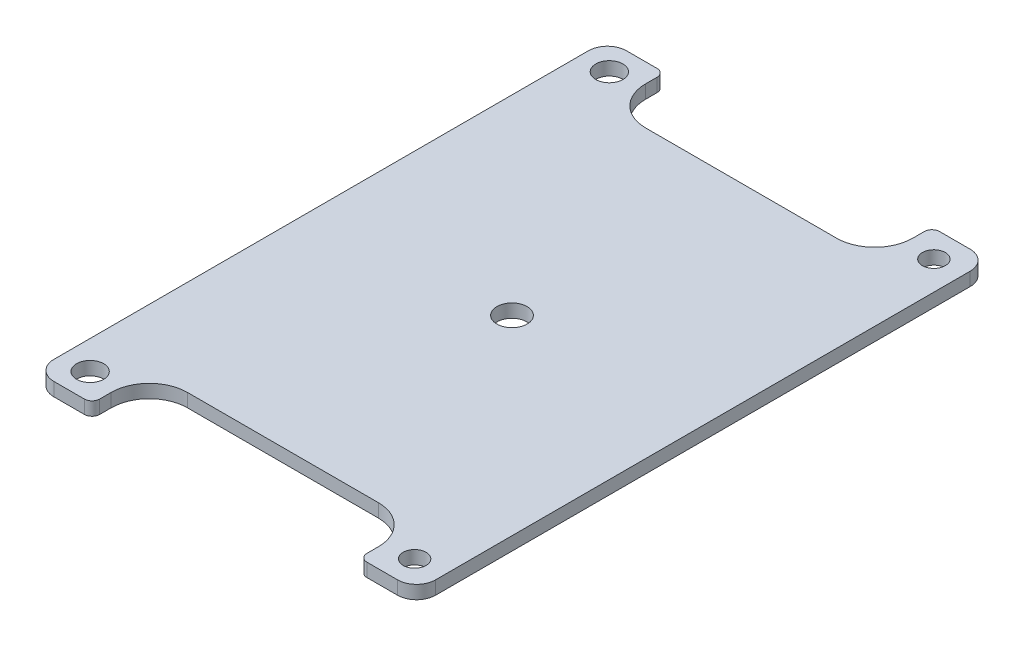
ISO-10303-21;
HEADER;
FILE_DESCRIPTION(('STEP AP214'),'2;1');
FILE_NAME('part.step','',(''),(''),'','','');
FILE_SCHEMA(('AUTOMOTIVE_DESIGN { 1 0 10303 214 1 1 1 1 }'));
ENDSEC;
DATA;
#1=APPLICATION_CONTEXT('core data for automotive mechanical design processes');
#2=APPLICATION_PROTOCOL_DEFINITION('international standard','automotive_design',2000,#1);
#3=PRODUCT_CONTEXT('',#1,'mechanical');
#4=PRODUCT('Part','Part','',(#3));
#5=PRODUCT_RELATED_PRODUCT_CATEGORY('part','',(#4));
#6=PRODUCT_DEFINITION_FORMATION('','',#4);
#7=PRODUCT_DEFINITION_CONTEXT('part definition',#1,'design');
#8=PRODUCT_DEFINITION('design','',#6,#7);
#9=PRODUCT_DEFINITION_SHAPE('','',#8);
#10=(LENGTH_UNIT() NAMED_UNIT(*) SI_UNIT(.MILLI.,.METRE.));
#11=(NAMED_UNIT(*) PLANE_ANGLE_UNIT() SI_UNIT($,.RADIAN.));
#12=(NAMED_UNIT(*) SI_UNIT($,.STERADIAN.) SOLID_ANGLE_UNIT());
#13=UNCERTAINTY_MEASURE_WITH_UNIT(LENGTH_MEASURE(1.E-05),#10,'distance_accuracy_value','');
#14=(GEOMETRIC_REPRESENTATION_CONTEXT(3) GLOBAL_UNCERTAINTY_ASSIGNED_CONTEXT((#13)) GLOBAL_UNIT_ASSIGNED_CONTEXT((#10,
#11,#12)) REPRESENTATION_CONTEXT('',''));
#15=CARTESIAN_POINT('',(0.,0.,0.));
#16=DIRECTION('',(0.,0.,1.));
#17=DIRECTION('',(1.,0.,0.));
#18=AXIS2_PLACEMENT_3D('',#15,#16,#17);
#19=CARTESIAN_POINT('',(-45.,3.5,-70.));
#20=DIRECTION('',(0.,-1.,0.));
#21=DIRECTION('',(0.,0.,-1.));
#22=AXIS2_PLACEMENT_3D('',#19,#20,#21);
#23=CYLINDRICAL_SURFACE('',#22,5.);
#24=CARTESIAN_POINT('',(-45.,0.,-70.));
#25=DIRECTION('',(0.,1.,0.));
#26=DIRECTION('',(0.,0.,1.));
#27=AXIS2_PLACEMENT_3D('',#24,#25,#26);
#28=CIRCLE('',#27,5.);
#29=CARTESIAN_POINT('',(-45.,0.,-75.));
#30=VERTEX_POINT('',#29);
#31=CARTESIAN_POINT('',(-50.,0.,-70.));
#32=VERTEX_POINT('',#31);
#33=EDGE_CURVE('E237',#30,#32,#28,.T.);
#34=ORIENTED_EDGE('',*,*,#33,.T.);
#35=DIRECTION('',(0.,-1.,0.));
#36=VECTOR('',#35,1.);
#37=CARTESIAN_POINT('',(-50.,3.5,-70.));
#38=LINE('',#37,#36);
#39=CARTESIAN_POINT('',(-50.,3.5,-70.));
#40=VERTEX_POINT('',#39);
#41=EDGE_CURVE('E11',#40,#32,#38,.T.);
#42=ORIENTED_EDGE('',*,*,#41,.F.);
#43=CARTESIAN_POINT('',(-45.,3.5,-70.));
#44=DIRECTION('',(0.,1.,0.));
#45=DIRECTION('',(0.,0.,1.));
#46=AXIS2_PLACEMENT_3D('',#43,#44,#45);
#47=CIRCLE('',#46,5.);
#48=CARTESIAN_POINT('',(-45.,3.5,-75.));
#49=VERTEX_POINT('',#48);
#50=EDGE_CURVE('E300',#49,#40,#47,.T.);
#51=ORIENTED_EDGE('',*,*,#50,.F.);
#52=DIRECTION('',(0.,-1.,0.));
#53=VECTOR('',#52,1.);
#54=CARTESIAN_POINT('',(-45.,3.5,-75.));
#55=LINE('',#54,#53);
#56=EDGE_CURVE('E59',#49,#30,#55,.T.);
#57=ORIENTED_EDGE('',*,*,#56,.T.);
#58=EDGE_LOOP('',(#34,#42,#51,#57));
#59=FACE_BOUND('',#58,.T.);
#60=ADVANCED_FACE('F43',(#59),#23,.T.);
#61=CARTESIAN_POINT('',(-50.,3.5,-70.));
#62=DIRECTION('',(1.,0.,0.));
#63=DIRECTION('',(0.,0.,-1.));
#64=AXIS2_PLACEMENT_3D('',#61,#62,#63);
#65=PLANE('',#64);
#66=DIRECTION('',(0.,0.,1.));
#67=VECTOR('',#66,1.);
#68=CARTESIAN_POINT('',(-50.,0.,-70.));
#69=LINE('',#68,#67);
#70=CARTESIAN_POINT('',(-50.,0.,70.));
#71=VERTEX_POINT('',#70);
#72=EDGE_CURVE('E239',#32,#71,#69,.T.);
#73=ORIENTED_EDGE('',*,*,#72,.T.);
#74=DIRECTION('',(0.,-1.,0.));
#75=VECTOR('',#74,1.);
#76=CARTESIAN_POINT('',(-50.,3.5,70.));
#77=LINE('',#76,#75);
#78=CARTESIAN_POINT('',(-50.,3.5,70.));
#79=VERTEX_POINT('',#78);
#80=EDGE_CURVE('E51',#79,#71,#77,.T.);
#81=ORIENTED_EDGE('',*,*,#80,.F.);
#82=DIRECTION('',(0.,0.,1.));
#83=VECTOR('',#82,1.);
#84=CARTESIAN_POINT('',(-50.,3.5,-70.));
#85=LINE('',#84,#83);
#86=EDGE_CURVE('E146',#40,#79,#85,.T.);
#87=ORIENTED_EDGE('',*,*,#86,.F.);
#88=ORIENTED_EDGE('',*,*,#41,.T.);
#89=EDGE_LOOP('',(#73,#81,#87,#88));
#90=FACE_BOUND('',#89,.T.);
#91=ADVANCED_FACE('F428',(#90),#65,.F.);
#92=CARTESIAN_POINT('',(-45.,3.5,70.));
#93=DIRECTION('',(0.,-1.,0.));
#94=DIRECTION('',(0.,0.,-1.));
#95=AXIS2_PLACEMENT_3D('',#92,#93,#94);
#96=CYLINDRICAL_SURFACE('',#95,5.);
#97=CARTESIAN_POINT('',(-45.,0.,70.));
#98=DIRECTION('',(0.,1.,0.));
#99=DIRECTION('',(0.,0.,1.));
#100=AXIS2_PLACEMENT_3D('',#97,#98,#99);
#101=CIRCLE('',#100,5.);
#102=CARTESIAN_POINT('',(-45.,0.,75.));
#103=VERTEX_POINT('',#102);
#104=EDGE_CURVE('E242',#71,#103,#101,.T.);
#105=ORIENTED_EDGE('',*,*,#104,.T.);
#106=DIRECTION('',(0.,-1.,0.));
#107=VECTOR('',#106,1.);
#108=CARTESIAN_POINT('',(-45.,3.5,75.));
#109=LINE('',#108,#107);
#110=CARTESIAN_POINT('',(-45.,3.5,75.));
#111=VERTEX_POINT('',#110);
#112=EDGE_CURVE('E341',#111,#103,#109,.T.);
#113=ORIENTED_EDGE('',*,*,#112,.F.);
#114=CARTESIAN_POINT('',(-45.,3.5,70.));
#115=DIRECTION('',(0.,1.,0.));
#116=DIRECTION('',(0.,0.,1.));
#117=AXIS2_PLACEMENT_3D('',#114,#115,#116);
#118=CIRCLE('',#117,5.);
#119=EDGE_CURVE('E349',#79,#111,#118,.T.);
#120=ORIENTED_EDGE('',*,*,#119,.F.);
#121=ORIENTED_EDGE('',*,*,#80,.T.);
#122=EDGE_LOOP('',(#105,#113,#120,#121));
#123=FACE_BOUND('',#122,.T.);
#124=ADVANCED_FACE('F347',(#123),#96,.T.);
#125=CARTESIAN_POINT('',(-45.,3.5,75.));
#126=DIRECTION('',(0.,0.,-1.));
#127=DIRECTION('',(-1.,0.,0.));
#128=AXIS2_PLACEMENT_3D('',#125,#126,#127);
#129=PLANE('',#128);
#130=DIRECTION('',(1.,0.,0.));
#131=VECTOR('',#130,1.);
#132=CARTESIAN_POINT('',(-45.,0.,75.));
#133=LINE('',#132,#131);
#134=CARTESIAN_POINT('',(-37.,0.,75.));
#135=VERTEX_POINT('',#134);
#136=EDGE_CURVE('E244',#103,#135,#133,.T.);
#137=ORIENTED_EDGE('',*,*,#136,.T.);
#138=DIRECTION('',(0.,-1.,0.));
#139=VECTOR('',#138,1.);
#140=CARTESIAN_POINT('',(-37.,3.5,75.));
#141=LINE('',#140,#139);
#142=CARTESIAN_POINT('',(-37.,3.5,75.));
#143=VERTEX_POINT('',#142);
#144=EDGE_CURVE('E339',#143,#135,#141,.T.);
#145=ORIENTED_EDGE('',*,*,#144,.F.);
#146=DIRECTION('',(1.,0.,0.));
#147=VECTOR('',#146,1.);
#148=CARTESIAN_POINT('',(-45.,3.5,75.));
#149=LINE('',#148,#147);
#150=EDGE_CURVE('E359',#111,#143,#149,.T.);
#151=ORIENTED_EDGE('',*,*,#150,.F.);
#152=ORIENTED_EDGE('',*,*,#112,.T.);
#153=EDGE_LOOP('',(#137,#145,#151,#152));
#154=FACE_BOUND('',#153,.T.);
#155=ADVANCED_FACE('F356',(#154),#129,.F.);
#156=CARTESIAN_POINT('',(-37.,3.5,73.));
#157=DIRECTION('',(0.,-1.,0.));
#158=DIRECTION('',(0.,0.,-1.));
#159=AXIS2_PLACEMENT_3D('',#156,#157,#158);
#160=CYLINDRICAL_SURFACE('',#159,2.);
#161=CARTESIAN_POINT('',(-37.,0.,73.));
#162=DIRECTION('',(0.,-1.,0.));
#163=DIRECTION('',(0.,0.,-1.));
#164=AXIS2_PLACEMENT_3D('',#161,#162,#163);
#165=CIRCLE('',#164,2.);
#166=CARTESIAN_POINT('',(-35.,0.,73.));
#167=VERTEX_POINT('',#166);
#168=EDGE_CURVE('E247',#167,#135,#165,.T.);
#169=ORIENTED_EDGE('',*,*,#168,.F.);
#170=DIRECTION('',(0.,-1.,0.));
#171=VECTOR('',#170,1.);
#172=CARTESIAN_POINT('',(-35.,3.5,73.));
#173=LINE('',#172,#171);
#174=CARTESIAN_POINT('',(-35.,3.5,73.));
#175=VERTEX_POINT('',#174);
#176=EDGE_CURVE('E337',#175,#167,#173,.T.);
#177=ORIENTED_EDGE('',*,*,#176,.F.);
#178=CARTESIAN_POINT('',(-37.,3.5,73.));
#179=DIRECTION('',(0.,-1.,0.));
#180=DIRECTION('',(0.,0.,-1.));
#181=AXIS2_PLACEMENT_3D('',#178,#179,#180);
#182=CIRCLE('',#181,2.);
#183=EDGE_CURVE('E361',#175,#143,#182,.T.);
#184=ORIENTED_EDGE('',*,*,#183,.T.);
#185=ORIENTED_EDGE('',*,*,#144,.T.);
#186=EDGE_LOOP('',(#169,#177,#184,#185));
#187=FACE_BOUND('',#186,.T.);
#188=ADVANCED_FACE('F755',(#187),#160,.T.);
#189=CARTESIAN_POINT('',(-35.,3.5,70.0000000000001));
#190=DIRECTION('',(1.,0.,0.));
#191=DIRECTION('',(0.,0.,-1.));
#192=AXIS2_PLACEMENT_3D('',#189,#190,#191);
#193=PLANE('',#192);
#194=DIRECTION('',(0.,0.,1.));
#195=VECTOR('',#194,1.);
#196=CARTESIAN_POINT('',(-35.,0.,70.0000000000001));
#197=LINE('',#196,#195);
#198=CARTESIAN_POINT('',(-35.,0.,70.0000000000001));
#199=VERTEX_POINT('',#198);
#200=EDGE_CURVE('E250',#199,#167,#197,.T.);
#201=ORIENTED_EDGE('',*,*,#200,.F.);
#202=DIRECTION('',(0.,-1.,0.));
#203=VECTOR('',#202,1.);
#204=CARTESIAN_POINT('',(-35.,3.5,70.0000000000001));
#205=LINE('',#204,#203);
#206=CARTESIAN_POINT('',(-35.,3.5,70.0000000000001));
#207=VERTEX_POINT('',#206);
#208=EDGE_CURVE('E335',#207,#199,#205,.T.);
#209=ORIENTED_EDGE('',*,*,#208,.F.);
#210=DIRECTION('',(0.,0.,1.));
#211=VECTOR('',#210,1.);
#212=CARTESIAN_POINT('',(-35.,3.5,70.0000000000001));
#213=LINE('',#212,#211);
#214=EDGE_CURVE('E363',#207,#175,#213,.T.);
#215=ORIENTED_EDGE('',*,*,#214,.T.);
#216=ORIENTED_EDGE('',*,*,#176,.T.);
#217=EDGE_LOOP('',(#201,#209,#215,#216));
#218=FACE_BOUND('',#217,.T.);
#219=ADVANCED_FACE('F744',(#218),#193,.T.);
#220=CARTESIAN_POINT('',(-25.,3.5,70.));
#221=DIRECTION('',(0.,-1.,0.));
#222=DIRECTION('',(0.,0.,-1.));
#223=AXIS2_PLACEMENT_3D('',#220,#221,#222);
#224=CYLINDRICAL_SURFACE('',#223,10.);
#225=CARTESIAN_POINT('',(-25.,0.,70.));
#226=DIRECTION('',(0.,1.,0.));
#227=DIRECTION('',(0.,0.,1.));
#228=AXIS2_PLACEMENT_3D('',#225,#226,#227);
#229=CIRCLE('',#228,10.);
#230=CARTESIAN_POINT('',(-24.9999999999999,0.,60.));
#231=VERTEX_POINT('',#230);
#232=EDGE_CURVE('E253',#231,#199,#229,.T.);
#233=ORIENTED_EDGE('',*,*,#232,.F.);
#234=DIRECTION('',(0.,-1.,0.));
#235=VECTOR('',#234,1.);
#236=CARTESIAN_POINT('',(-24.9999999999999,3.5,60.));
#237=LINE('',#236,#235);
#238=CARTESIAN_POINT('',(-24.9999999999999,3.5,60.));
#239=VERTEX_POINT('',#238);
#240=EDGE_CURVE('E333',#239,#231,#237,.T.);
#241=ORIENTED_EDGE('',*,*,#240,.F.);
#242=CARTESIAN_POINT('',(-25.,3.5,70.));
#243=DIRECTION('',(0.,1.,0.));
#244=DIRECTION('',(0.,0.,1.));
#245=AXIS2_PLACEMENT_3D('',#242,#243,#244);
#246=CIRCLE('',#245,10.);
#247=EDGE_CURVE('E370',#239,#207,#246,.T.);
#248=ORIENTED_EDGE('',*,*,#247,.T.);
#249=ORIENTED_EDGE('',*,*,#208,.T.);
#250=EDGE_LOOP('',(#233,#241,#248,#249));
#251=FACE_BOUND('',#250,.T.);
#252=ADVANCED_FACE('F733',(#251),#224,.F.);
#253=CARTESIAN_POINT('',(-24.9999999999999,3.5,60.));
#254=DIRECTION('',(0.,0.,-1.));
#255=DIRECTION('',(-1.,0.,0.));
#256=AXIS2_PLACEMENT_3D('',#253,#254,#255);
#257=PLANE('',#256);
#258=DIRECTION('',(1.,0.,0.));
#259=VECTOR('',#258,1.);
#260=CARTESIAN_POINT('',(-24.9999999999999,0.,60.));
#261=LINE('',#260,#259);
#262=CARTESIAN_POINT('',(24.9999999999999,0.,60.));
#263=VERTEX_POINT('',#262);
#264=EDGE_CURVE('E256',#231,#263,#261,.T.);
#265=ORIENTED_EDGE('',*,*,#264,.T.);
#266=DIRECTION('',(0.,-1.,0.));
#267=VECTOR('',#266,1.);
#268=CARTESIAN_POINT('',(24.9999999999999,3.5,60.));
#269=LINE('',#268,#267);
#270=CARTESIAN_POINT('',(24.9999999999999,3.5,60.));
#271=VERTEX_POINT('',#270);
#272=EDGE_CURVE('E331',#271,#263,#269,.T.);
#273=ORIENTED_EDGE('',*,*,#272,.F.);
#274=DIRECTION('',(1.,0.,0.));
#275=VECTOR('',#274,1.);
#276=CARTESIAN_POINT('',(-24.9999999999999,3.5,60.));
#277=LINE('',#276,#275);
#278=EDGE_CURVE('E373',#239,#271,#277,.T.);
#279=ORIENTED_EDGE('',*,*,#278,.F.);
#280=ORIENTED_EDGE('',*,*,#240,.T.);
#281=EDGE_LOOP('',(#265,#273,#279,#280));
#282=FACE_BOUND('',#281,.T.);
#283=ADVANCED_FACE('F722',(#282),#257,.F.);
#284=CARTESIAN_POINT('',(25.,3.5,70.));
#285=DIRECTION('',(0.,-1.,0.));
#286=DIRECTION('',(0.,0.,-1.));
#287=AXIS2_PLACEMENT_3D('',#284,#285,#286);
#288=CYLINDRICAL_SURFACE('',#287,10.);
#289=CARTESIAN_POINT('',(25.,0.,70.));
#290=DIRECTION('',(0.,1.,0.));
#291=DIRECTION('',(0.,0.,1.));
#292=AXIS2_PLACEMENT_3D('',#289,#290,#291);
#293=CIRCLE('',#292,10.);
#294=CARTESIAN_POINT('',(35.,0.,70.0000000000001));
#295=VERTEX_POINT('',#294);
#296=EDGE_CURVE('E259',#295,#263,#293,.T.);
#297=ORIENTED_EDGE('',*,*,#296,.F.);
#298=DIRECTION('',(0.,-1.,0.));
#299=VECTOR('',#298,1.);
#300=CARTESIAN_POINT('',(35.,3.5,70.0000000000001));
#301=LINE('',#300,#299);
#302=CARTESIAN_POINT('',(35.,3.5,70.0000000000001));
#303=VERTEX_POINT('',#302);
#304=EDGE_CURVE('E329',#303,#295,#301,.T.);
#305=ORIENTED_EDGE('',*,*,#304,.F.);
#306=CARTESIAN_POINT('',(25.,3.5,70.));
#307=DIRECTION('',(0.,1.,0.));
#308=DIRECTION('',(0.,0.,1.));
#309=AXIS2_PLACEMENT_3D('',#306,#307,#308);
#310=CIRCLE('',#309,10.);
#311=EDGE_CURVE('E375',#303,#271,#310,.T.);
#312=ORIENTED_EDGE('',*,*,#311,.T.);
#313=ORIENTED_EDGE('',*,*,#272,.T.);
#314=EDGE_LOOP('',(#297,#305,#312,#313));
#315=FACE_BOUND('',#314,.T.);
#316=ADVANCED_FACE('F711',(#315),#288,.F.);
#317=CARTESIAN_POINT('',(35.,3.5,70.0000000000001));
#318=DIRECTION('',(1.,0.,0.));
#319=DIRECTION('',(0.,0.,-1.));
#320=AXIS2_PLACEMENT_3D('',#317,#318,#319);
#321=PLANE('',#320);
#322=DIRECTION('',(0.,0.,1.));
#323=VECTOR('',#322,1.);
#324=CARTESIAN_POINT('',(35.,0.,70.0000000000001));
#325=LINE('',#324,#323);
#326=CARTESIAN_POINT('',(35.,0.,73.));
#327=VERTEX_POINT('',#326);
#328=EDGE_CURVE('E262',#295,#327,#325,.T.);
#329=ORIENTED_EDGE('',*,*,#328,.T.);
#330=DIRECTION('',(0.,-1.,0.));
#331=VECTOR('',#330,1.);
#332=CARTESIAN_POINT('',(35.,3.5,73.));
#333=LINE('',#332,#331);
#334=CARTESIAN_POINT('',(35.,3.5,73.));
#335=VERTEX_POINT('',#334);
#336=EDGE_CURVE('E326',#335,#327,#333,.T.);
#337=ORIENTED_EDGE('',*,*,#336,.F.);
#338=DIRECTION('',(0.,0.,1.));
#339=VECTOR('',#338,1.);
#340=CARTESIAN_POINT('',(35.,3.5,70.0000000000001));
#341=LINE('',#340,#339);
#342=EDGE_CURVE('E378',#303,#335,#341,.T.);
#343=ORIENTED_EDGE('',*,*,#342,.F.);
#344=ORIENTED_EDGE('',*,*,#304,.T.);
#345=EDGE_LOOP('',(#329,#337,#343,#344));
#346=FACE_BOUND('',#345,.T.);
#347=ADVANCED_FACE('F700',(#346),#321,.F.);
#348=CARTESIAN_POINT('',(37.,3.5,73.));
#349=DIRECTION('',(0.,-1.,0.));
#350=DIRECTION('',(0.,0.,-1.));
#351=AXIS2_PLACEMENT_3D('',#348,#349,#350);
#352=CYLINDRICAL_SURFACE('',#351,2.);
#353=CARTESIAN_POINT('',(37.,0.,73.));
#354=DIRECTION('',(0.,1.,0.));
#355=DIRECTION('',(0.,0.,1.));
#356=AXIS2_PLACEMENT_3D('',#353,#354,#355);
#357=CIRCLE('',#356,2.);
#358=CARTESIAN_POINT('',(37.,0.,75.));
#359=VERTEX_POINT('',#358);
#360=EDGE_CURVE('E264',#327,#359,#357,.T.);
#361=ORIENTED_EDGE('',*,*,#360,.T.);
#362=DIRECTION('',(0.,-1.,0.));
#363=VECTOR('',#362,1.);
#364=CARTESIAN_POINT('',(37.,3.5,75.));
#365=LINE('',#364,#363);
#366=CARTESIAN_POINT('',(37.,3.5,75.));
#367=VERTEX_POINT('',#366);
#368=EDGE_CURVE('E323',#367,#359,#365,.T.);
#369=ORIENTED_EDGE('',*,*,#368,.F.);
#370=CARTESIAN_POINT('',(37.,3.5,73.));
#371=DIRECTION('',(0.,1.,0.));
#372=DIRECTION('',(0.,0.,1.));
#373=AXIS2_PLACEMENT_3D('',#370,#371,#372);
#374=CIRCLE('',#373,2.);
#375=EDGE_CURVE('E380',#335,#367,#374,.T.);
#376=ORIENTED_EDGE('',*,*,#375,.F.);
#377=ORIENTED_EDGE('',*,*,#336,.T.);
#378=EDGE_LOOP('',(#361,#369,#376,#377));
#379=FACE_BOUND('',#378,.T.);
#380=ADVANCED_FACE('F689',(#379),#352,.T.);
#381=CARTESIAN_POINT('',(37.,3.5,75.));
#382=DIRECTION('',(0.,0.,-1.));
#383=DIRECTION('',(-1.,0.,0.));
#384=AXIS2_PLACEMENT_3D('',#381,#382,#383);
#385=PLANE('',#384);
#386=DIRECTION('',(1.,0.,0.));
#387=VECTOR('',#386,1.);
#388=CARTESIAN_POINT('',(37.,0.,75.));
#389=LINE('',#388,#387);
#390=CARTESIAN_POINT('',(45.,0.,75.));
#391=VERTEX_POINT('',#390);
#392=EDGE_CURVE('E266',#359,#391,#389,.T.);
#393=ORIENTED_EDGE('',*,*,#392,.T.);
#394=DIRECTION('',(0.,-1.,0.));
#395=VECTOR('',#394,1.);
#396=CARTESIAN_POINT('',(45.,3.5,75.));
#397=LINE('',#396,#395);
#398=CARTESIAN_POINT('',(45.,3.5,75.));
#399=VERTEX_POINT('',#398);
#400=EDGE_CURVE('E320',#399,#391,#397,.T.);
#401=ORIENTED_EDGE('',*,*,#400,.F.);
#402=DIRECTION('',(1.,0.,0.));
#403=VECTOR('',#402,1.);
#404=CARTESIAN_POINT('',(37.,3.5,75.));
#405=LINE('',#404,#403);
#406=EDGE_CURVE('E382',#367,#399,#405,.T.);
#407=ORIENTED_EDGE('',*,*,#406,.F.);
#408=ORIENTED_EDGE('',*,*,#368,.T.);
#409=EDGE_LOOP('',(#393,#401,#407,#408));
#410=FACE_BOUND('',#409,.T.);
#411=ADVANCED_FACE('F678',(#410),#385,.F.);
#412=CARTESIAN_POINT('',(45.,3.5,70.));
#413=DIRECTION('',(0.,-1.,0.));
#414=DIRECTION('',(0.,0.,-1.));
#415=AXIS2_PLACEMENT_3D('',#412,#413,#414);
#416=CYLINDRICAL_SURFACE('',#415,5.);
#417=CARTESIAN_POINT('',(45.,0.,70.));
#418=DIRECTION('',(0.,1.,0.));
#419=DIRECTION('',(0.,0.,1.));
#420=AXIS2_PLACEMENT_3D('',#417,#418,#419);
#421=CIRCLE('',#420,5.);
#422=CARTESIAN_POINT('',(50.,0.,70.));
#423=VERTEX_POINT('',#422);
#424=EDGE_CURVE('E268',#391,#423,#421,.T.);
#425=ORIENTED_EDGE('',*,*,#424,.T.);
#426=DIRECTION('',(0.,-1.,0.));
#427=VECTOR('',#426,1.);
#428=CARTESIAN_POINT('',(50.,3.5,70.));
#429=LINE('',#428,#427);
#430=CARTESIAN_POINT('',(50.,3.5,70.));
#431=VERTEX_POINT('',#430);
#432=EDGE_CURVE('E318',#431,#423,#429,.T.);
#433=ORIENTED_EDGE('',*,*,#432,.F.);
#434=CARTESIAN_POINT('',(45.,3.5,70.));
#435=DIRECTION('',(0.,1.,0.));
#436=DIRECTION('',(0.,0.,1.));
#437=AXIS2_PLACEMENT_3D('',#434,#435,#436);
#438=CIRCLE('',#437,5.);
#439=EDGE_CURVE('E384',#399,#431,#438,.T.);
#440=ORIENTED_EDGE('',*,*,#439,.F.);
#441=ORIENTED_EDGE('',*,*,#400,.T.);
#442=EDGE_LOOP('',(#425,#433,#440,#441));
#443=FACE_BOUND('',#442,.T.);
#444=ADVANCED_FACE('F667',(#443),#416,.T.);
#445=CARTESIAN_POINT('',(50.,3.5,-70.));
#446=DIRECTION('',(1.,0.,0.));
#447=DIRECTION('',(0.,0.,-1.));
#448=AXIS2_PLACEMENT_3D('',#445,#446,#447);
#449=PLANE('',#448);
#450=DIRECTION('',(0.,0.,1.));
#451=VECTOR('',#450,1.);
#452=CARTESIAN_POINT('',(50.,0.,-70.));
#453=LINE('',#452,#451);
#454=CARTESIAN_POINT('',(50.,0.,-70.));
#455=VERTEX_POINT('',#454);
#456=EDGE_CURVE('E271',#455,#423,#453,.T.);
#457=ORIENTED_EDGE('',*,*,#456,.F.);
#458=DIRECTION('',(0.,-1.,0.));
#459=VECTOR('',#458,1.);
#460=CARTESIAN_POINT('',(50.,3.5,-70.));
#461=LINE('',#460,#459);
#462=CARTESIAN_POINT('',(50.,3.5,-70.));
#463=VERTEX_POINT('',#462);
#464=EDGE_CURVE('E316',#463,#455,#461,.T.);
#465=ORIENTED_EDGE('',*,*,#464,.F.);
#466=DIRECTION('',(0.,0.,1.));
#467=VECTOR('',#466,1.);
#468=CARTESIAN_POINT('',(50.,3.5,-70.));
#469=LINE('',#468,#467);
#470=EDGE_CURVE('E386',#463,#431,#469,.T.);
#471=ORIENTED_EDGE('',*,*,#470,.T.);
#472=ORIENTED_EDGE('',*,*,#432,.T.);
#473=EDGE_LOOP('',(#457,#465,#471,#472));
#474=FACE_BOUND('',#473,.T.);
#475=ADVANCED_FACE('F656',(#474),#449,.T.);
#476=CARTESIAN_POINT('',(45.,3.5,-70.));
#477=DIRECTION('',(0.,-1.,0.));
#478=DIRECTION('',(0.,0.,-1.));
#479=AXIS2_PLACEMENT_3D('',#476,#477,#478);
#480=CYLINDRICAL_SURFACE('',#479,5.);
#481=CARTESIAN_POINT('',(45.,0.,-70.));
#482=DIRECTION('',(0.,-1.,0.));
#483=DIRECTION('',(0.,0.,-1.));
#484=AXIS2_PLACEMENT_3D('',#481,#482,#483);
#485=CIRCLE('',#484,5.);
#486=CARTESIAN_POINT('',(45.,0.,-75.));
#487=VERTEX_POINT('',#486);
#488=EDGE_CURVE('E274',#487,#455,#485,.T.);
#489=ORIENTED_EDGE('',*,*,#488,.F.);
#490=DIRECTION('',(0.,-1.,0.));
#491=VECTOR('',#490,1.);
#492=CARTESIAN_POINT('',(45.,3.5,-75.));
#493=LINE('',#492,#491);
#494=CARTESIAN_POINT('',(45.,3.5,-75.));
#495=VERTEX_POINT('',#494);
#496=EDGE_CURVE('E314',#495,#487,#493,.T.);
#497=ORIENTED_EDGE('',*,*,#496,.F.);
#498=CARTESIAN_POINT('',(45.,3.5,-70.));
#499=DIRECTION('',(0.,-1.,0.));
#500=DIRECTION('',(0.,0.,-1.));
#501=AXIS2_PLACEMENT_3D('',#498,#499,#500);
#502=CIRCLE('',#501,5.);
#503=EDGE_CURVE('E389',#495,#463,#502,.T.);
#504=ORIENTED_EDGE('',*,*,#503,.T.);
#505=ORIENTED_EDGE('',*,*,#464,.T.);
#506=EDGE_LOOP('',(#489,#497,#504,#505));
#507=FACE_BOUND('',#506,.T.);
#508=ADVANCED_FACE('F645',(#507),#480,.T.);
#509=CARTESIAN_POINT('',(37.,3.5,-75.));
#510=DIRECTION('',(0.,0.,-1.));
#511=DIRECTION('',(-1.,0.,0.));
#512=AXIS2_PLACEMENT_3D('',#509,#510,#511);
#513=PLANE('',#512);
#514=DIRECTION('',(1.,0.,0.));
#515=VECTOR('',#514,1.);
#516=CARTESIAN_POINT('',(37.,0.,-75.));
#517=LINE('',#516,#515);
#518=CARTESIAN_POINT('',(37.,0.,-75.));
#519=VERTEX_POINT('',#518);
#520=EDGE_CURVE('E277',#519,#487,#517,.T.);
#521=ORIENTED_EDGE('',*,*,#520,.F.);
#522=DIRECTION('',(0.,-1.,0.));
#523=VECTOR('',#522,1.);
#524=CARTESIAN_POINT('',(37.,3.5,-75.));
#525=LINE('',#524,#523);
#526=CARTESIAN_POINT('',(37.,3.5,-75.));
#527=VERTEX_POINT('',#526);
#528=EDGE_CURVE('E312',#527,#519,#525,.T.);
#529=ORIENTED_EDGE('',*,*,#528,.F.);
#530=DIRECTION('',(1.,0.,0.));
#531=VECTOR('',#530,1.);
#532=CARTESIAN_POINT('',(37.,3.5,-75.));
#533=LINE('',#532,#531);
#534=EDGE_CURVE('E392',#527,#495,#533,.T.);
#535=ORIENTED_EDGE('',*,*,#534,.T.);
#536=ORIENTED_EDGE('',*,*,#496,.T.);
#537=EDGE_LOOP('',(#521,#529,#535,#536));
#538=FACE_BOUND('',#537,.T.);
#539=ADVANCED_FACE('F634',(#538),#513,.T.);
#540=CARTESIAN_POINT('',(37.,3.5,-73.));
#541=DIRECTION('',(0.,-1.,0.));
#542=DIRECTION('',(0.,0.,-1.));
#543=AXIS2_PLACEMENT_3D('',#540,#541,#542);
#544=CYLINDRICAL_SURFACE('',#543,2.);
#545=CARTESIAN_POINT('',(37.,0.,-73.));
#546=DIRECTION('',(0.,-1.,0.));
#547=DIRECTION('',(0.,0.,-1.));
#548=AXIS2_PLACEMENT_3D('',#545,#546,#547);
#549=CIRCLE('',#548,2.);
#550=CARTESIAN_POINT('',(35.,0.,-73.));
#551=VERTEX_POINT('',#550);
#552=EDGE_CURVE('E280',#551,#519,#549,.T.);
#553=ORIENTED_EDGE('',*,*,#552,.F.);
#554=DIRECTION('',(0.,-1.,0.));
#555=VECTOR('',#554,1.);
#556=CARTESIAN_POINT('',(35.,3.5,-73.));
#557=LINE('',#556,#555);
#558=CARTESIAN_POINT('',(35.,3.5,-73.));
#559=VERTEX_POINT('',#558);
#560=EDGE_CURVE('E310',#559,#551,#557,.T.);
#561=ORIENTED_EDGE('',*,*,#560,.F.);
#562=CARTESIAN_POINT('',(37.,3.5,-73.));
#563=DIRECTION('',(0.,-1.,0.));
#564=DIRECTION('',(0.,0.,-1.));
#565=AXIS2_PLACEMENT_3D('',#562,#563,#564);
#566=CIRCLE('',#565,2.);
#567=EDGE_CURVE('E395',#559,#527,#566,.T.);
#568=ORIENTED_EDGE('',*,*,#567,.T.);
#569=ORIENTED_EDGE('',*,*,#528,.T.);
#570=EDGE_LOOP('',(#553,#561,#568,#569));
#571=FACE_BOUND('',#570,.T.);
#572=ADVANCED_FACE('F623',(#571),#544,.T.);
#573=CARTESIAN_POINT('',(35.,3.5,-70.0000000000001));
#574=DIRECTION('',(-1.,0.,0.));
#575=DIRECTION('',(0.,0.,1.));
#576=AXIS2_PLACEMENT_3D('',#573,#574,#575);
#577=PLANE('',#576);
#578=DIRECTION('',(0.,0.,-1.));
#579=VECTOR('',#578,1.);
#580=CARTESIAN_POINT('',(35.,0.,-70.0000000000001));
#581=LINE('',#580,#579);
#582=CARTESIAN_POINT('',(35.,0.,-70.0000000000001));
#583=VERTEX_POINT('',#582);
#584=EDGE_CURVE('E283',#583,#551,#581,.T.);
#585=ORIENTED_EDGE('',*,*,#584,.F.);
#586=DIRECTION('',(0.,-1.,0.));
#587=VECTOR('',#586,1.);
#588=CARTESIAN_POINT('',(35.,3.5,-70.0000000000001));
#589=LINE('',#588,#587);
#590=CARTESIAN_POINT('',(35.,3.5,-70.0000000000001));
#591=VERTEX_POINT('',#590);
#592=EDGE_CURVE('E308',#591,#583,#589,.T.);
#593=ORIENTED_EDGE('',*,*,#592,.F.);
#594=DIRECTION('',(0.,0.,-1.));
#595=VECTOR('',#594,1.);
#596=CARTESIAN_POINT('',(35.,3.5,-70.0000000000001));
#597=LINE('',#596,#595);
#598=EDGE_CURVE('E398',#591,#559,#597,.T.);
#599=ORIENTED_EDGE('',*,*,#598,.T.);
#600=ORIENTED_EDGE('',*,*,#560,.T.);
#601=EDGE_LOOP('',(#585,#593,#599,#600));
#602=FACE_BOUND('',#601,.T.);
#603=ADVANCED_FACE('F613',(#602),#577,.T.);
#604=CARTESIAN_POINT('',(25.,3.5,-70.));
#605=DIRECTION('',(0.,-1.,0.));
#606=DIRECTION('',(0.,0.,-1.));
#607=AXIS2_PLACEMENT_3D('',#604,#605,#606);
#608=CYLINDRICAL_SURFACE('',#607,10.);
#609=CARTESIAN_POINT('',(25.,0.,-70.));
#610=DIRECTION('',(0.,1.,0.));
#611=DIRECTION('',(0.,0.,1.));
#612=AXIS2_PLACEMENT_3D('',#609,#610,#611);
#613=CIRCLE('',#612,10.);
#614=CARTESIAN_POINT('',(24.9999999999999,0.,-60.));
#615=VERTEX_POINT('',#614);
#616=EDGE_CURVE('E286',#615,#583,#613,.T.);
#617=ORIENTED_EDGE('',*,*,#616,.F.);
#618=DIRECTION('',(0.,-1.,0.));
#619=VECTOR('',#618,1.);
#620=CARTESIAN_POINT('',(24.9999999999999,3.5,-60.));
#621=LINE('',#620,#619);
#622=CARTESIAN_POINT('',(24.9999999999999,3.5,-60.));
#623=VERTEX_POINT('',#622);
#624=EDGE_CURVE('E306',#623,#615,#621,.T.);
#625=ORIENTED_EDGE('',*,*,#624,.F.);
#626=CARTESIAN_POINT('',(25.,3.5,-70.));
#627=DIRECTION('',(0.,1.,0.));
#628=DIRECTION('',(0.,0.,1.));
#629=AXIS2_PLACEMENT_3D('',#626,#627,#628);
#630=CIRCLE('',#629,10.);
#631=EDGE_CURVE('E401',#623,#591,#630,.T.);
#632=ORIENTED_EDGE('',*,*,#631,.T.);
#633=ORIENTED_EDGE('',*,*,#592,.T.);
#634=EDGE_LOOP('',(#617,#625,#632,#633));
#635=FACE_BOUND('',#634,.T.);
#636=ADVANCED_FACE('F414',(#635),#608,.F.);
#637=CARTESIAN_POINT('',(-24.9999999999999,3.5,-60.));
#638=DIRECTION('',(0.,0.,-1.));
#639=DIRECTION('',(-1.,0.,0.));
#640=AXIS2_PLACEMENT_3D('',#637,#638,#639);
#641=PLANE('',#640);
#642=DIRECTION('',(1.,0.,0.));
#643=VECTOR('',#642,1.);
#644=CARTESIAN_POINT('',(-24.9999999999999,0.,-60.));
#645=LINE('',#644,#643);
#646=CARTESIAN_POINT('',(-24.9999999999999,0.,-60.));
#647=VERTEX_POINT('',#646);
#648=EDGE_CURVE('E289',#647,#615,#645,.T.);
#649=ORIENTED_EDGE('',*,*,#648,.F.);
#650=DIRECTION('',(0.,-1.,0.));
#651=VECTOR('',#650,1.);
#652=CARTESIAN_POINT('',(-24.9999999999999,3.5,-60.));
#653=LINE('',#652,#651);
#654=CARTESIAN_POINT('',(-24.9999999999999,3.5,-60.));
#655=VERTEX_POINT('',#654);
#656=EDGE_CURVE('E304',#655,#647,#653,.T.);
#657=ORIENTED_EDGE('',*,*,#656,.F.);
#658=DIRECTION('',(1.,0.,0.));
#659=VECTOR('',#658,1.);
#660=CARTESIAN_POINT('',(-24.9999999999999,3.5,-60.));
#661=LINE('',#660,#659);
#662=EDGE_CURVE('E404',#655,#623,#661,.T.);
#663=ORIENTED_EDGE('',*,*,#662,.T.);
#664=ORIENTED_EDGE('',*,*,#624,.T.);
#665=EDGE_LOOP('',(#649,#657,#663,#664));
#666=FACE_BOUND('',#665,.T.);
#667=ADVANCED_FACE('F408',(#666),#641,.T.);
#668=CARTESIAN_POINT('',(-25.,3.5,-70.));
#669=DIRECTION('',(0.,-1.,0.));
#670=DIRECTION('',(0.,0.,-1.));
#671=AXIS2_PLACEMENT_3D('',#668,#669,#670);
#672=CYLINDRICAL_SURFACE('',#671,10.);
#673=CARTESIAN_POINT('',(-25.,0.,-70.));
#674=DIRECTION('',(0.,-1.,0.));
#675=DIRECTION('',(0.,0.,-1.));
#676=AXIS2_PLACEMENT_3D('',#673,#674,#675);
#677=CIRCLE('',#676,10.);
#678=CARTESIAN_POINT('',(-35.,0.,-70.0000000000001));
#679=VERTEX_POINT('',#678);
#680=EDGE_CURVE('E292',#647,#679,#677,.T.);
#681=ORIENTED_EDGE('',*,*,#680,.T.);
#682=DIRECTION('',(0.,-1.,0.));
#683=VECTOR('',#682,1.);
#684=CARTESIAN_POINT('',(-35.,3.5,-70.0000000000001));
#685=LINE('',#684,#683);
#686=CARTESIAN_POINT('',(-35.,3.5,-70.0000000000001));
#687=VERTEX_POINT('',#686);
#688=EDGE_CURVE('E229',#687,#679,#685,.T.);
#689=ORIENTED_EDGE('',*,*,#688,.F.);
#690=CARTESIAN_POINT('',(-25.,3.5,-70.));
#691=DIRECTION('',(0.,-1.,0.));
#692=DIRECTION('',(0.,0.,-1.));
#693=AXIS2_PLACEMENT_3D('',#690,#691,#692);
#694=CIRCLE('',#693,10.);
#695=EDGE_CURVE('E217',#655,#687,#694,.T.);
#696=ORIENTED_EDGE('',*,*,#695,.F.);
#697=ORIENTED_EDGE('',*,*,#656,.T.);
#698=EDGE_LOOP('',(#681,#689,#696,#697));
#699=FACE_BOUND('',#698,.T.);
#700=ADVANCED_FACE('F418',(#699),#672,.F.);
#701=CARTESIAN_POINT('',(-35.,3.5,-70.0000000000001));
#702=DIRECTION('',(-1.,0.,0.));
#703=DIRECTION('',(0.,0.,1.));
#704=AXIS2_PLACEMENT_3D('',#701,#702,#703);
#705=PLANE('',#704);
#706=DIRECTION('',(0.,0.,-1.));
#707=VECTOR('',#706,1.);
#708=CARTESIAN_POINT('',(-35.,0.,-70.0000000000001));
#709=LINE('',#708,#707);
#710=CARTESIAN_POINT('',(-35.,0.,-73.));
#711=VERTEX_POINT('',#710);
#712=EDGE_CURVE('E226',#679,#711,#709,.T.);
#713=ORIENTED_EDGE('',*,*,#712,.T.);
#714=DIRECTION('',(0.,-1.,0.));
#715=VECTOR('',#714,1.);
#716=CARTESIAN_POINT('',(-35.,3.5,-73.));
#717=LINE('',#716,#715);
#718=CARTESIAN_POINT('',(-35.,3.5,-73.));
#719=VERTEX_POINT('',#718);
#720=EDGE_CURVE('E223',#719,#711,#717,.T.);
#721=ORIENTED_EDGE('',*,*,#720,.F.);
#722=DIRECTION('',(0.,0.,-1.));
#723=VECTOR('',#722,1.);
#724=CARTESIAN_POINT('',(-35.,3.5,-70.0000000000001));
#725=LINE('',#724,#723);
#726=EDGE_CURVE('E209',#687,#719,#725,.T.);
#727=ORIENTED_EDGE('',*,*,#726,.F.);
#728=ORIENTED_EDGE('',*,*,#688,.T.);
#729=EDGE_LOOP('',(#713,#721,#727,#728));
#730=FACE_BOUND('',#729,.T.);
#731=ADVANCED_FACE('F224',(#730),#705,.F.);
#732=CARTESIAN_POINT('',(-37.,3.5,-73.));
#733=DIRECTION('',(0.,-1.,0.));
#734=DIRECTION('',(0.,0.,-1.));
#735=AXIS2_PLACEMENT_3D('',#732,#733,#734);
#736=CYLINDRICAL_SURFACE('',#735,2.);
#737=CARTESIAN_POINT('',(-37.,0.,-73.));
#738=DIRECTION('',(0.,1.,0.));
#739=DIRECTION('',(0.,0.,1.));
#740=AXIS2_PLACEMENT_3D('',#737,#738,#739);
#741=CIRCLE('',#740,2.);
#742=CARTESIAN_POINT('',(-37.,0.,-75.));
#743=VERTEX_POINT('',#742);
#744=EDGE_CURVE('E295',#711,#743,#741,.T.);
#745=ORIENTED_EDGE('',*,*,#744,.T.);
#746=DIRECTION('',(0.,-1.,0.));
#747=VECTOR('',#746,1.);
#748=CARTESIAN_POINT('',(-37.,3.5,-75.));
#749=LINE('',#748,#747);
#750=CARTESIAN_POINT('',(-37.,3.5,-75.));
#751=VERTEX_POINT('',#750);
#752=EDGE_CURVE('E134',#751,#743,#749,.T.);
#753=ORIENTED_EDGE('',*,*,#752,.F.);
#754=CARTESIAN_POINT('',(-37.,3.5,-73.));
#755=DIRECTION('',(0.,1.,0.));
#756=DIRECTION('',(0.,0.,1.));
#757=AXIS2_PLACEMENT_3D('',#754,#755,#756);
#758=CIRCLE('',#757,2.);
#759=EDGE_CURVE('E214',#719,#751,#758,.T.);
#760=ORIENTED_EDGE('',*,*,#759,.F.);
#761=ORIENTED_EDGE('',*,*,#720,.T.);
#762=EDGE_LOOP('',(#745,#753,#760,#761));
#763=FACE_BOUND('',#762,.T.);
#764=ADVANCED_FACE('F231',(#763),#736,.T.);
#765=CARTESIAN_POINT('',(-45.,3.5,-75.));
#766=DIRECTION('',(0.,0.,-1.));
#767=DIRECTION('',(-1.,0.,0.));
#768=AXIS2_PLACEMENT_3D('',#765,#766,#767);
#769=PLANE('',#768);
#770=DIRECTION('',(1.,0.,0.));
#771=VECTOR('',#770,1.);
#772=CARTESIAN_POINT('',(-45.,0.,-75.));
#773=LINE('',#772,#771);
#774=EDGE_CURVE('E297',#30,#743,#773,.T.);
#775=ORIENTED_EDGE('',*,*,#774,.F.);
#776=ORIENTED_EDGE('',*,*,#56,.F.);
#777=DIRECTION('',(1.,0.,0.));
#778=VECTOR('',#777,1.);
#779=CARTESIAN_POINT('',(-45.,3.5,-75.));
#780=LINE('',#779,#778);
#781=EDGE_CURVE('E232',#49,#751,#780,.T.);
#782=ORIENTED_EDGE('',*,*,#781,.T.);
#783=ORIENTED_EDGE('',*,*,#752,.T.);
#784=EDGE_LOOP('',(#775,#776,#782,#783));
#785=FACE_BOUND('',#784,.T.);
#786=ADVANCED_FACE('F433',(#785),#769,.T.);
#787=CARTESIAN_POINT('',(-45.,3.5,-70.));
#788=DIRECTION('',(0.,1.,0.));
#789=DIRECTION('',(0.,0.,1.));
#790=AXIS2_PLACEMENT_3D('',#787,#788,#789);
#791=PLANE('',#790);
#792=CARTESIAN_POINT('',(-42.5,3.5,68.));
#793=DIRECTION('',(0.,1.,0.));
#794=DIRECTION('',(0.,0.,1.));
#795=AXIS2_PLACEMENT_3D('',#792,#793,#794);
#796=CIRCLE('',#795,3.54844416029089);
#797=CARTESIAN_POINT('',(-42.5,3.5,71.5484441602909));
#798=VERTEX_POINT('',#797);
#799=EDGE_CURVE('E240',#798,#798,#796,.T.);
#800=ORIENTED_EDGE('',*,*,#799,.F.);
#801=EDGE_LOOP('',(#800));
#802=FACE_BOUND('',#801,.T.);
#803=CARTESIAN_POINT('',(42.5,3.5,68.));
#804=DIRECTION('',(0.,1.,0.));
#805=DIRECTION('',(0.,0.,1.));
#806=AXIS2_PLACEMENT_3D('',#803,#804,#805);
#807=CIRCLE('',#806,3.);
#808=CARTESIAN_POINT('',(42.5,3.5,71.));
#809=VERTEX_POINT('',#808);
#810=EDGE_CURVE('E497',#809,#809,#807,.T.);
#811=ORIENTED_EDGE('',*,*,#810,.F.);
#812=EDGE_LOOP('',(#811));
#813=FACE_BOUND('',#812,.T.);
#814=CARTESIAN_POINT('',(-42.5,3.5,-68.));
#815=DIRECTION('',(0.,1.,0.));
#816=DIRECTION('',(0.,0.,1.));
#817=AXIS2_PLACEMENT_3D('',#814,#815,#816);
#818=CIRCLE('',#817,3.54844416029089);
#819=CARTESIAN_POINT('',(-42.5,3.5,-64.4515558397091));
#820=VERTEX_POINT('',#819);
#821=EDGE_CURVE('E494',#820,#820,#818,.T.);
#822=ORIENTED_EDGE('',*,*,#821,.F.);
#823=EDGE_LOOP('',(#822));
#824=FACE_BOUND('',#823,.T.);
#825=CARTESIAN_POINT('',(42.5,3.5,-68.));
#826=DIRECTION('',(0.,1.,0.));
#827=DIRECTION('',(0.,0.,1.));
#828=AXIS2_PLACEMENT_3D('',#825,#826,#827);
#829=CIRCLE('',#828,3.);
#830=CARTESIAN_POINT('',(42.5,3.5,-65.));
#831=VERTEX_POINT('',#830);
#832=EDGE_CURVE('E471',#831,#831,#829,.T.);
#833=ORIENTED_EDGE('',*,*,#832,.F.);
#834=EDGE_LOOP('',(#833));
#835=FACE_BOUND('',#834,.T.);
#836=CARTESIAN_POINT('',(0.,3.5,0.));
#837=DIRECTION('',(0.,1.,0.));
#838=DIRECTION('',(0.,0.,1.));
#839=AXIS2_PLACEMENT_3D('',#836,#837,#838);
#840=CIRCLE('',#839,3.96875);
#841=CARTESIAN_POINT('',(0.,3.5,3.96875));
#842=VERTEX_POINT('',#841);
#843=EDGE_CURVE('E480',#842,#842,#840,.T.);
#844=ORIENTED_EDGE('',*,*,#843,.F.);
#845=EDGE_LOOP('',(#844));
#846=FACE_BOUND('',#845,.T.);
#847=ORIENTED_EDGE('',*,*,#50,.T.);
#848=ORIENTED_EDGE('',*,*,#86,.T.);
#849=ORIENTED_EDGE('',*,*,#119,.T.);
#850=ORIENTED_EDGE('',*,*,#150,.T.);
#851=ORIENTED_EDGE('',*,*,#183,.F.);
#852=ORIENTED_EDGE('',*,*,#214,.F.);
#853=ORIENTED_EDGE('',*,*,#247,.F.);
#854=ORIENTED_EDGE('',*,*,#278,.T.);
#855=ORIENTED_EDGE('',*,*,#311,.F.);
#856=ORIENTED_EDGE('',*,*,#342,.T.);
#857=ORIENTED_EDGE('',*,*,#375,.T.);
#858=ORIENTED_EDGE('',*,*,#406,.T.);
#859=ORIENTED_EDGE('',*,*,#439,.T.);
#860=ORIENTED_EDGE('',*,*,#470,.F.);
#861=ORIENTED_EDGE('',*,*,#503,.F.);
#862=ORIENTED_EDGE('',*,*,#534,.F.);
#863=ORIENTED_EDGE('',*,*,#567,.F.);
#864=ORIENTED_EDGE('',*,*,#598,.F.);
#865=ORIENTED_EDGE('',*,*,#631,.F.);
#866=ORIENTED_EDGE('',*,*,#662,.F.);
#867=ORIENTED_EDGE('',*,*,#695,.T.);
#868=ORIENTED_EDGE('',*,*,#726,.T.);
#869=ORIENTED_EDGE('',*,*,#759,.T.);
#870=ORIENTED_EDGE('',*,*,#781,.F.);
#871=EDGE_LOOP('',(#847,#848,#849,#850,#851,#852,#853,#854,#855,#856,#857,#858,#859,#860,#861,
#862,#863,#864,#865,#866,#867,#868,#869,#870));
#872=FACE_BOUND('',#871,.T.);
#873=ADVANCED_FACE('F211',(#802,#813,#824,#835,#846,#872),#791,.T.);
#874=CARTESIAN_POINT('',(-45.,0.,-70.));
#875=DIRECTION('',(0.,1.,0.));
#876=DIRECTION('',(0.,0.,1.));
#877=AXIS2_PLACEMENT_3D('',#874,#875,#876);
#878=PLANE('',#877);
#879=CARTESIAN_POINT('',(-42.5,0.,68.));
#880=DIRECTION('',(0.,-1.,0.));
#881=DIRECTION('',(0.,0.,-1.));
#882=AXIS2_PLACEMENT_3D('',#879,#880,#881);
#883=CIRCLE('',#882,3.54844416029089);
#884=CARTESIAN_POINT('',(-42.5,0.,64.4515558397091));
#885=VERTEX_POINT('',#884);
#886=EDGE_CURVE('E488',#885,#885,#883,.T.);
#887=ORIENTED_EDGE('',*,*,#886,.F.);
#888=EDGE_LOOP('',(#887));
#889=FACE_BOUND('',#888,.T.);
#890=CARTESIAN_POINT('',(42.5,0.,68.));
#891=DIRECTION('',(0.,-1.,0.));
#892=DIRECTION('',(0.,0.,-1.));
#893=AXIS2_PLACEMENT_3D('',#890,#891,#892);
#894=CIRCLE('',#893,3.);
#895=CARTESIAN_POINT('',(42.5,0.,65.));
#896=VERTEX_POINT('',#895);
#897=EDGE_CURVE('E483',#896,#896,#894,.T.);
#898=ORIENTED_EDGE('',*,*,#897,.F.);
#899=EDGE_LOOP('',(#898));
#900=FACE_BOUND('',#899,.T.);
#901=CARTESIAN_POINT('',(-42.5,0.,-68.));
#902=DIRECTION('',(0.,-1.,0.));
#903=DIRECTION('',(0.,0.,-1.));
#904=AXIS2_PLACEMENT_3D('',#901,#902,#903);
#905=CIRCLE('',#904,3.54844416029089);
#906=CARTESIAN_POINT('',(-42.5,0.,-71.5484441602909));
#907=VERTEX_POINT('',#906);
#908=EDGE_CURVE('E477',#907,#907,#905,.T.);
#909=ORIENTED_EDGE('',*,*,#908,.F.);
#910=EDGE_LOOP('',(#909));
#911=FACE_BOUND('',#910,.T.);
#912=CARTESIAN_POINT('',(42.5,0.,-68.));
#913=DIRECTION('',(0.,-1.,0.));
#914=DIRECTION('',(0.,0.,-1.));
#915=AXIS2_PLACEMENT_3D('',#912,#913,#914);
#916=CIRCLE('',#915,3.);
#917=CARTESIAN_POINT('',(42.5,0.,-71.));
#918=VERTEX_POINT('',#917);
#919=EDGE_CURVE('E474',#918,#918,#916,.T.);
#920=ORIENTED_EDGE('',*,*,#919,.F.);
#921=EDGE_LOOP('',(#920));
#922=FACE_BOUND('',#921,.T.);
#923=CARTESIAN_POINT('',(0.,0.,0.));
#924=DIRECTION('',(0.,-1.,0.));
#925=DIRECTION('',(0.,0.,-1.));
#926=AXIS2_PLACEMENT_3D('',#923,#924,#925);
#927=CIRCLE('',#926,3.96875);
#928=CARTESIAN_POINT('',(0.,0.,-3.96875));
#929=VERTEX_POINT('',#928);
#930=EDGE_CURVE('E476',#929,#929,#927,.T.);
#931=ORIENTED_EDGE('',*,*,#930,.F.);
#932=EDGE_LOOP('',(#931));
#933=FACE_BOUND('',#932,.T.);
#934=ORIENTED_EDGE('',*,*,#33,.F.);
#935=ORIENTED_EDGE('',*,*,#774,.T.);
#936=ORIENTED_EDGE('',*,*,#744,.F.);
#937=ORIENTED_EDGE('',*,*,#712,.F.);
#938=ORIENTED_EDGE('',*,*,#680,.F.);
#939=ORIENTED_EDGE('',*,*,#648,.T.);
#940=ORIENTED_EDGE('',*,*,#616,.T.);
#941=ORIENTED_EDGE('',*,*,#584,.T.);
#942=ORIENTED_EDGE('',*,*,#552,.T.);
#943=ORIENTED_EDGE('',*,*,#520,.T.);
#944=ORIENTED_EDGE('',*,*,#488,.T.);
#945=ORIENTED_EDGE('',*,*,#456,.T.);
#946=ORIENTED_EDGE('',*,*,#424,.F.);
#947=ORIENTED_EDGE('',*,*,#392,.F.);
#948=ORIENTED_EDGE('',*,*,#360,.F.);
#949=ORIENTED_EDGE('',*,*,#328,.F.);
#950=ORIENTED_EDGE('',*,*,#296,.T.);
#951=ORIENTED_EDGE('',*,*,#264,.F.);
#952=ORIENTED_EDGE('',*,*,#232,.T.);
#953=ORIENTED_EDGE('',*,*,#200,.T.);
#954=ORIENTED_EDGE('',*,*,#168,.T.);
#955=ORIENTED_EDGE('',*,*,#136,.F.);
#956=ORIENTED_EDGE('',*,*,#104,.F.);
#957=ORIENTED_EDGE('',*,*,#72,.F.);
#958=EDGE_LOOP('',(#934,#935,#936,#937,#938,#939,#940,#941,#942,#943,#944,#945,#946,#947,#948,
#949,#950,#951,#952,#953,#954,#955,#956,#957));
#959=FACE_BOUND('',#958,.T.);
#960=ADVANCED_FACE('F352',(#889,#900,#911,#922,#933,#959),#878,.F.);
#961=CARTESIAN_POINT('',(0.,6.,0.));
#962=DIRECTION('',(0.,-1.,0.));
#963=DIRECTION('',(0.,0.,-1.));
#964=AXIS2_PLACEMENT_3D('',#961,#962,#963);
#965=CYLINDRICAL_SURFACE('',#964,3.96875);
#966=ORIENTED_EDGE('',*,*,#843,.T.);
#967=EDGE_LOOP('',(#966));
#968=FACE_BOUND('',#967,.T.);
#969=ORIENTED_EDGE('',*,*,#930,.T.);
#970=EDGE_LOOP('',(#969));
#971=FACE_BOUND('',#970,.T.);
#972=ADVANCED_FACE('F445',(#968,#971),#965,.F.);
#973=CARTESIAN_POINT('',(42.5,6.,-68.));
#974=DIRECTION('',(0.,-1.,0.));
#975=DIRECTION('',(0.,0.,-1.));
#976=AXIS2_PLACEMENT_3D('',#973,#974,#975);
#977=CYLINDRICAL_SURFACE('',#976,3.);
#978=ORIENTED_EDGE('',*,*,#832,.T.);
#979=EDGE_LOOP('',(#978));
#980=FACE_BOUND('',#979,.T.);
#981=ORIENTED_EDGE('',*,*,#919,.T.);
#982=EDGE_LOOP('',(#981));
#983=FACE_BOUND('',#982,.T.);
#984=ADVANCED_FACE('F450',(#980,#983),#977,.F.);
#985=CARTESIAN_POINT('',(-42.5,6.,-68.));
#986=DIRECTION('',(0.,-1.,0.));
#987=DIRECTION('',(0.,0.,-1.));
#988=AXIS2_PLACEMENT_3D('',#985,#986,#987);
#989=CYLINDRICAL_SURFACE('',#988,3.54844416029089);
#990=ORIENTED_EDGE('',*,*,#821,.T.);
#991=EDGE_LOOP('',(#990));
#992=FACE_BOUND('',#991,.T.);
#993=ORIENTED_EDGE('',*,*,#908,.T.);
#994=EDGE_LOOP('',(#993));
#995=FACE_BOUND('',#994,.T.);
#996=ADVANCED_FACE('F459',(#992,#995),#989,.F.);
#997=CARTESIAN_POINT('',(42.5,6.,68.));
#998=DIRECTION('',(0.,-1.,0.));
#999=DIRECTION('',(0.,0.,-1.));
#1000=AXIS2_PLACEMENT_3D('',#997,#998,#999);
#1001=CYLINDRICAL_SURFACE('',#1000,3.);
#1002=ORIENTED_EDGE('',*,*,#810,.T.);
#1003=EDGE_LOOP('',(#1002));
#1004=FACE_BOUND('',#1003,.T.);
#1005=ORIENTED_EDGE('',*,*,#897,.T.);
#1006=EDGE_LOOP('',(#1005));
#1007=FACE_BOUND('',#1006,.T.);
#1008=ADVANCED_FACE('F455',(#1004,#1007),#1001,.F.);
#1009=CARTESIAN_POINT('',(-42.5,6.,68.));
#1010=DIRECTION('',(0.,-1.,0.));
#1011=DIRECTION('',(0.,0.,-1.));
#1012=AXIS2_PLACEMENT_3D('',#1009,#1010,#1011);
#1013=CYLINDRICAL_SURFACE('',#1012,3.54844416029089);
#1014=ORIENTED_EDGE('',*,*,#799,.T.);
#1015=EDGE_LOOP('',(#1014));
#1016=FACE_BOUND('',#1015,.T.);
#1017=ORIENTED_EDGE('',*,*,#886,.T.);
#1018=EDGE_LOOP('',(#1017));
#1019=FACE_BOUND('',#1018,.T.);
#1020=ADVANCED_FACE('F452',(#1016,#1019),#1013,.F.);
#1021=CLOSED_SHELL('',(#60,#91,#124,#155,#188,#219,#252,#283,#316,#347,#380,#411,#444,#475,#508,
#539,#572,#603,#636,#667,#700,#731,#764,#786,#873,#960,#972,#984,#996,#1008,#1020));
#1022=MANIFOLD_SOLID_BREP('B2',#1021);
#1023=ADVANCED_BREP_SHAPE_REPRESENTATION('',(#18,#1022),#14);
#1024=SHAPE_DEFINITION_REPRESENTATION(#9,#1023);
ENDSEC;
END-ISO-10303-21;
